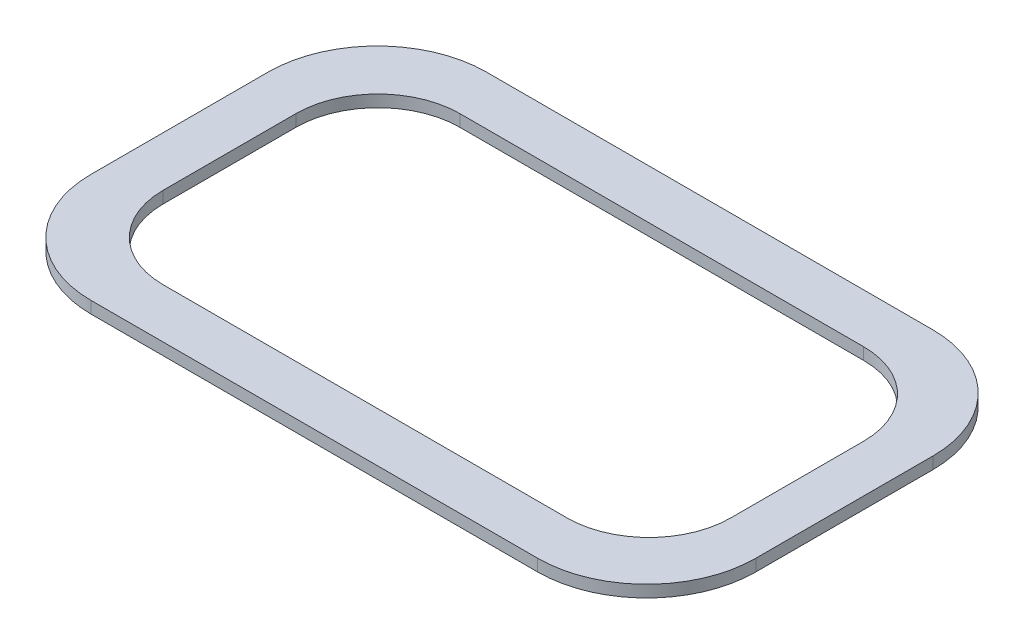
ISO-10303-21;
HEADER;
FILE_DESCRIPTION(('STEP AP214'),'2;1');
FILE_NAME('part.step','',(''),(''),'','','');
FILE_SCHEMA(('AUTOMOTIVE_DESIGN { 1 0 10303 214 1 1 1 1 }'));
ENDSEC;
DATA;
#1=APPLICATION_CONTEXT('core data for automotive mechanical design processes');
#2=APPLICATION_PROTOCOL_DEFINITION('international standard','automotive_design',2000,#1);
#3=PRODUCT_CONTEXT('',#1,'mechanical');
#4=PRODUCT('Part','Part','',(#3));
#5=PRODUCT_RELATED_PRODUCT_CATEGORY('part','',(#4));
#6=PRODUCT_DEFINITION_FORMATION('','',#4);
#7=PRODUCT_DEFINITION_CONTEXT('part definition',#1,'design');
#8=PRODUCT_DEFINITION('design','',#6,#7);
#9=PRODUCT_DEFINITION_SHAPE('','',#8);
#10=(LENGTH_UNIT() NAMED_UNIT(*) SI_UNIT(.MILLI.,.METRE.));
#11=(NAMED_UNIT(*) PLANE_ANGLE_UNIT() SI_UNIT($,.RADIAN.));
#12=(NAMED_UNIT(*) SI_UNIT($,.STERADIAN.) SOLID_ANGLE_UNIT());
#13=UNCERTAINTY_MEASURE_WITH_UNIT(LENGTH_MEASURE(1.E-05),#10,'distance_accuracy_value','');
#14=(GEOMETRIC_REPRESENTATION_CONTEXT(3) GLOBAL_UNCERTAINTY_ASSIGNED_CONTEXT((#13)) GLOBAL_UNIT_ASSIGNED_CONTEXT((#10,
#11,#12)) REPRESENTATION_CONTEXT('',''));
#15=CARTESIAN_POINT('',(0.,0.,0.));
#16=DIRECTION('',(0.,0.,1.));
#17=DIRECTION('',(1.,0.,0.));
#18=AXIS2_PLACEMENT_3D('',#15,#16,#17);
#19=CARTESIAN_POINT('',(-21.0437864395169,6.,113.126130914256));
#20=DIRECTION('',(0.,1.,0.));
#21=DIRECTION('',(0.,0.,1.));
#22=AXIS2_PLACEMENT_3D('',#19,#20,#21);
#23=PLANE('',#22);
#24=CARTESIAN_POINT('',(-21.0437864395169,6.,113.126130914256));
#25=DIRECTION('',(0.,1.,0.));
#26=DIRECTION('',(0.,0.,1.));
#27=AXIS2_PLACEMENT_3D('',#24,#25,#26);
#28=CIRCLE('',#27,55.);
#29=CARTESIAN_POINT('',(-76.0437864395169,6.,113.126130914255));
#30=VERTEX_POINT('',#29);
#31=CARTESIAN_POINT('',(-21.0437864395165,6.,168.126130914256));
#32=VERTEX_POINT('',#31);
#33=EDGE_CURVE('E211',#30,#32,#28,.T.);
#34=ORIENTED_EDGE('',*,*,#33,.T.);
#35=DIRECTION('',(1.,0.,0.));
#36=VECTOR('',#35,1.);
#37=CARTESIAN_POINT('',(-21.0437864395165,6.,168.126130914256));
#38=LINE('',#37,#36);
#39=CARTESIAN_POINT('',(203.986213560483,6.,168.126130914256));
#40=VERTEX_POINT('',#39);
#41=EDGE_CURVE('E214',#32,#40,#38,.T.);
#42=ORIENTED_EDGE('',*,*,#41,.T.);
#43=CARTESIAN_POINT('',(203.986213560483,6.,113.126130914256));
#44=DIRECTION('',(0.,1.,0.));
#45=DIRECTION('',(0.,0.,1.));
#46=AXIS2_PLACEMENT_3D('',#43,#44,#45);
#47=CIRCLE('',#46,55.);
#48=CARTESIAN_POINT('',(258.986213560483,6.,113.126130914255));
#49=VERTEX_POINT('',#48);
#50=EDGE_CURVE('E217',#40,#49,#47,.T.);
#51=ORIENTED_EDGE('',*,*,#50,.T.);
#52=DIRECTION('',(0.,0.,-1.));
#53=VECTOR('',#52,1.);
#54=CARTESIAN_POINT('',(258.986213560483,6.,23.8661309142561));
#55=LINE('',#54,#53);
#56=CARTESIAN_POINT('',(258.986213560483,6.,23.8661309142561));
#57=VERTEX_POINT('',#56);
#58=EDGE_CURVE('E219',#49,#57,#55,.T.);
#59=ORIENTED_EDGE('',*,*,#58,.T.);
#60=CARTESIAN_POINT('',(203.986213560483,6.,23.8661309142557));
#61=DIRECTION('',(0.,1.,0.));
#62=DIRECTION('',(0.,0.,-1.));
#63=AXIS2_PLACEMENT_3D('',#60,#61,#62);
#64=CIRCLE('',#63,55.);
#65=CARTESIAN_POINT('',(203.986213560483,6.,-31.1338690857443));
#66=VERTEX_POINT('',#65);
#67=EDGE_CURVE('E221',#57,#66,#64,.T.);
#68=ORIENTED_EDGE('',*,*,#67,.T.);
#69=DIRECTION('',(-1.,0.,0.));
#70=VECTOR('',#69,1.);
#71=CARTESIAN_POINT('',(-21.0437864395165,6.,-31.1338690857443));
#72=LINE('',#71,#70);
#73=CARTESIAN_POINT('',(-21.0437864395165,6.,-31.1338690857443));
#74=VERTEX_POINT('',#73);
#75=EDGE_CURVE('E223',#66,#74,#72,.T.);
#76=ORIENTED_EDGE('',*,*,#75,.T.);
#77=CARTESIAN_POINT('',(-21.0437864395169,6.,23.8661309142557));
#78=DIRECTION('',(0.,1.,0.));
#79=DIRECTION('',(0.,0.,1.));
#80=AXIS2_PLACEMENT_3D('',#77,#78,#79);
#81=CIRCLE('',#80,55.);
#82=CARTESIAN_POINT('',(-76.0437864395169,6.,23.8661309142561));
#83=VERTEX_POINT('',#82);
#84=EDGE_CURVE('E225',#74,#83,#81,.T.);
#85=ORIENTED_EDGE('',*,*,#84,.T.);
#86=DIRECTION('',(0.,0.,1.));
#87=VECTOR('',#86,1.);
#88=CARTESIAN_POINT('',(-76.0437864395169,6.,23.8661309142561));
#89=LINE('',#88,#87);
#90=EDGE_CURVE('E227',#83,#30,#89,.T.);
#91=ORIENTED_EDGE('',*,*,#90,.T.);
#92=EDGE_LOOP('',(#34,#42,#51,#59,#68,#76,#85,#91));
#93=FACE_BOUND('',#92,.T.);
#94=DIRECTION('',(1.,0.,0.));
#95=VECTOR('',#94,1.);
#96=CARTESIAN_POINT('',(-9.66672983236241,6.,143.126130914256));
#97=LINE('',#96,#95);
#98=CARTESIAN_POINT('',(-9.66672983236241,6.,143.126130914256));
#99=VERTEX_POINT('',#98);
#100=CARTESIAN_POINT('',(193.844893330854,6.,143.126130914256));
#101=VERTEX_POINT('',#100);
#102=EDGE_CURVE('E154',#99,#101,#97,.T.);
#103=ORIENTED_EDGE('',*,*,#102,.F.);
#104=CARTESIAN_POINT('',(-9.66672983236272,6.,101.876130914256));
#105=DIRECTION('',(0.,1.,0.));
#106=DIRECTION('',(0.,0.,1.));
#107=AXIS2_PLACEMENT_3D('',#104,#105,#106);
#108=CIRCLE('',#107,41.25);
#109=CARTESIAN_POINT('',(-50.9167298323627,6.,101.876130914255));
#110=VERTEX_POINT('',#109);
#111=EDGE_CURVE('E146',#110,#99,#108,.T.);
#112=ORIENTED_EDGE('',*,*,#111,.F.);
#113=DIRECTION('',(0.,0.,1.));
#114=VECTOR('',#113,1.);
#115=CARTESIAN_POINT('',(-50.9167298323627,6.,34.931130914256));
#116=LINE('',#115,#114);
#117=CARTESIAN_POINT('',(-50.9167298323627,6.,34.931130914256));
#118=VERTEX_POINT('',#117);
#119=EDGE_CURVE('E179',#118,#110,#116,.T.);
#120=ORIENTED_EDGE('',*,*,#119,.F.);
#121=CARTESIAN_POINT('',(-9.66672983236275,6.,34.9311309142557));
#122=DIRECTION('',(0.,1.,0.));
#123=DIRECTION('',(0.,0.,1.));
#124=AXIS2_PLACEMENT_3D('',#121,#122,#123);
#125=CIRCLE('',#124,41.25);
#126=CARTESIAN_POINT('',(-9.66672983236247,6.,-6.31886908574426));
#127=VERTEX_POINT('',#126);
#128=EDGE_CURVE('E177',#127,#118,#125,.T.);
#129=ORIENTED_EDGE('',*,*,#128,.F.);
#130=DIRECTION('',(-1.,0.,0.));
#131=VECTOR('',#130,1.);
#132=CARTESIAN_POINT('',(-9.66672983236247,6.,-6.31886908574426));
#133=LINE('',#132,#131);
#134=CARTESIAN_POINT('',(193.844893330854,6.,-6.31886908574426));
#135=VERTEX_POINT('',#134);
#136=EDGE_CURVE('E175',#135,#127,#133,.T.);
#137=ORIENTED_EDGE('',*,*,#136,.F.);
#138=CARTESIAN_POINT('',(193.844893330854,6.,34.9311309142557));
#139=DIRECTION('',(0.,1.,0.));
#140=DIRECTION('',(0.,0.,-1.));
#141=AXIS2_PLACEMENT_3D('',#138,#139,#140);
#142=CIRCLE('',#141,41.25);
#143=CARTESIAN_POINT('',(235.094893330854,6.,34.931130914256));
#144=VERTEX_POINT('',#143);
#145=EDGE_CURVE('E173',#144,#135,#142,.T.);
#146=ORIENTED_EDGE('',*,*,#145,.F.);
#147=DIRECTION('',(0.,0.,-1.));
#148=VECTOR('',#147,1.);
#149=CARTESIAN_POINT('',(235.094893330854,6.,34.931130914256));
#150=LINE('',#149,#148);
#151=CARTESIAN_POINT('',(235.094893330854,6.,101.876130914255));
#152=VERTEX_POINT('',#151);
#153=EDGE_CURVE('E169',#152,#144,#150,.T.);
#154=ORIENTED_EDGE('',*,*,#153,.F.);
#155=CARTESIAN_POINT('',(193.844893330854,6.,101.876130914256));
#156=DIRECTION('',(0.,1.,0.));
#157=DIRECTION('',(0.,0.,1.));
#158=AXIS2_PLACEMENT_3D('',#155,#156,#157);
#159=CIRCLE('',#158,41.25);
#160=EDGE_CURVE('E167',#101,#152,#159,.T.);
#161=ORIENTED_EDGE('',*,*,#160,.F.);
#162=EDGE_LOOP('',(#103,#112,#120,#129,#137,#146,#154,#161));
#163=FACE_BOUND('',#162,.T.);
#164=ADVANCED_FACE('F33',(#93,#163),#23,.T.);
#165=CARTESIAN_POINT('',(-21.0437864395169,0.,113.126130914256));
#166=DIRECTION('',(0.,1.,0.));
#167=DIRECTION('',(0.,0.,1.));
#168=AXIS2_PLACEMENT_3D('',#165,#166,#167);
#169=PLANE('',#168);
#170=CARTESIAN_POINT('',(-21.0437864395169,0.,113.126130914256));
#171=DIRECTION('',(0.,1.,0.));
#172=DIRECTION('',(0.,0.,1.));
#173=AXIS2_PLACEMENT_3D('',#170,#171,#172);
#174=CIRCLE('',#173,55.);
#175=CARTESIAN_POINT('',(-76.0437864395169,0.,113.126130914255));
#176=VERTEX_POINT('',#175);
#177=CARTESIAN_POINT('',(-21.0437864395165,0.,168.126130914256));
#178=VERTEX_POINT('',#177);
#179=EDGE_CURVE('E162',#176,#178,#174,.T.);
#180=ORIENTED_EDGE('',*,*,#179,.F.);
#181=DIRECTION('',(0.,0.,1.));
#182=VECTOR('',#181,1.);
#183=CARTESIAN_POINT('',(-76.0437864395169,0.,23.8661309142561));
#184=LINE('',#183,#182);
#185=CARTESIAN_POINT('',(-76.0437864395169,0.,23.8661309142561));
#186=VERTEX_POINT('',#185);
#187=EDGE_CURVE('E215',#186,#176,#184,.T.);
#188=ORIENTED_EDGE('',*,*,#187,.F.);
#189=CARTESIAN_POINT('',(-21.0437864395169,0.,23.8661309142557));
#190=DIRECTION('',(0.,1.,0.));
#191=DIRECTION('',(0.,0.,1.));
#192=AXIS2_PLACEMENT_3D('',#189,#190,#191);
#193=CIRCLE('',#192,55.);
#194=CARTESIAN_POINT('',(-21.0437864395165,0.,-31.1338690857443));
#195=VERTEX_POINT('',#194);
#196=EDGE_CURVE('E242',#195,#186,#193,.T.);
#197=ORIENTED_EDGE('',*,*,#196,.F.);
#198=DIRECTION('',(-1.,0.,0.));
#199=VECTOR('',#198,1.);
#200=CARTESIAN_POINT('',(-21.0437864395165,0.,-31.1338690857443));
#201=LINE('',#200,#199);
#202=CARTESIAN_POINT('',(203.986213560483,0.,-31.1338690857443));
#203=VERTEX_POINT('',#202);
#204=EDGE_CURVE('E240',#203,#195,#201,.T.);
#205=ORIENTED_EDGE('',*,*,#204,.F.);
#206=CARTESIAN_POINT('',(203.986213560483,0.,23.8661309142557));
#207=DIRECTION('',(0.,1.,0.));
#208=DIRECTION('',(0.,0.,-1.));
#209=AXIS2_PLACEMENT_3D('',#206,#207,#208);
#210=CIRCLE('',#209,55.);
#211=CARTESIAN_POINT('',(258.986213560483,0.,23.8661309142561));
#212=VERTEX_POINT('',#211);
#213=EDGE_CURVE('E238',#212,#203,#210,.T.);
#214=ORIENTED_EDGE('',*,*,#213,.F.);
#215=DIRECTION('',(0.,0.,-1.));
#216=VECTOR('',#215,1.);
#217=CARTESIAN_POINT('',(258.986213560483,0.,23.8661309142561));
#218=LINE('',#217,#216);
#219=CARTESIAN_POINT('',(258.986213560483,0.,113.126130914255));
#220=VERTEX_POINT('',#219);
#221=EDGE_CURVE('E236',#220,#212,#218,.T.);
#222=ORIENTED_EDGE('',*,*,#221,.F.);
#223=CARTESIAN_POINT('',(203.986213560483,0.,113.126130914256));
#224=DIRECTION('',(0.,1.,0.));
#225=DIRECTION('',(0.,0.,1.));
#226=AXIS2_PLACEMENT_3D('',#223,#224,#225);
#227=CIRCLE('',#226,55.);
#228=CARTESIAN_POINT('',(203.986213560483,0.,168.126130914256));
#229=VERTEX_POINT('',#228);
#230=EDGE_CURVE('E234',#229,#220,#227,.T.);
#231=ORIENTED_EDGE('',*,*,#230,.F.);
#232=DIRECTION('',(1.,0.,0.));
#233=VECTOR('',#232,1.);
#234=CARTESIAN_POINT('',(-21.0437864395165,0.,168.126130914256));
#235=LINE('',#234,#233);
#236=EDGE_CURVE('E232',#178,#229,#235,.T.);
#237=ORIENTED_EDGE('',*,*,#236,.F.);
#238=EDGE_LOOP('',(#180,#188,#197,#205,#214,#222,#231,#237));
#239=FACE_BOUND('',#238,.T.);
#240=CARTESIAN_POINT('',(-9.66672983236272,0.,101.876130914256));
#241=DIRECTION('',(0.,1.,0.));
#242=DIRECTION('',(0.,0.,1.));
#243=AXIS2_PLACEMENT_3D('',#240,#241,#242);
#244=CIRCLE('',#243,41.25);
#245=CARTESIAN_POINT('',(-50.9167298323627,0.,101.876130914255));
#246=VERTEX_POINT('',#245);
#247=CARTESIAN_POINT('',(-9.66672983236241,0.,143.126130914256));
#248=VERTEX_POINT('',#247);
#249=EDGE_CURVE('E56',#246,#248,#244,.T.);
#250=ORIENTED_EDGE('',*,*,#249,.T.);
#251=DIRECTION('',(1.,0.,0.));
#252=VECTOR('',#251,1.);
#253=CARTESIAN_POINT('',(-9.66672983236241,0.,143.126130914256));
#254=LINE('',#253,#252);
#255=CARTESIAN_POINT('',(193.844893330854,0.,143.126130914256));
#256=VERTEX_POINT('',#255);
#257=EDGE_CURVE('E161',#248,#256,#254,.T.);
#258=ORIENTED_EDGE('',*,*,#257,.T.);
#259=CARTESIAN_POINT('',(193.844893330854,0.,101.876130914256));
#260=DIRECTION('',(0.,1.,0.));
#261=DIRECTION('',(0.,0.,1.));
#262=AXIS2_PLACEMENT_3D('',#259,#260,#261);
#263=CIRCLE('',#262,41.25);
#264=CARTESIAN_POINT('',(235.094893330854,0.,101.876130914255));
#265=VERTEX_POINT('',#264);
#266=EDGE_CURVE('E183',#256,#265,#263,.T.);
#267=ORIENTED_EDGE('',*,*,#266,.T.);
#268=DIRECTION('',(0.,0.,-1.));
#269=VECTOR('',#268,1.);
#270=CARTESIAN_POINT('',(235.094893330854,0.,34.931130914256));
#271=LINE('',#270,#269);
#272=CARTESIAN_POINT('',(235.094893330854,0.,34.931130914256));
#273=VERTEX_POINT('',#272);
#274=EDGE_CURVE('E186',#265,#273,#271,.T.);
#275=ORIENTED_EDGE('',*,*,#274,.T.);
#276=CARTESIAN_POINT('',(193.844893330854,0.,34.9311309142557));
#277=DIRECTION('',(0.,1.,0.));
#278=DIRECTION('',(0.,0.,-1.));
#279=AXIS2_PLACEMENT_3D('',#276,#277,#278);
#280=CIRCLE('',#279,41.25);
#281=CARTESIAN_POINT('',(193.844893330854,0.,-6.31886908574426));
#282=VERTEX_POINT('',#281);
#283=EDGE_CURVE('E189',#273,#282,#280,.T.);
#284=ORIENTED_EDGE('',*,*,#283,.T.);
#285=DIRECTION('',(-1.,0.,0.));
#286=VECTOR('',#285,1.);
#287=CARTESIAN_POINT('',(-9.66672983236247,0.,-6.31886908574426));
#288=LINE('',#287,#286);
#289=CARTESIAN_POINT('',(-9.66672983236247,0.,-6.31886908574426));
#290=VERTEX_POINT('',#289);
#291=EDGE_CURVE('E192',#282,#290,#288,.T.);
#292=ORIENTED_EDGE('',*,*,#291,.T.);
#293=CARTESIAN_POINT('',(-9.66672983236275,0.,34.9311309142557));
#294=DIRECTION('',(0.,1.,0.));
#295=DIRECTION('',(0.,0.,1.));
#296=AXIS2_PLACEMENT_3D('',#293,#294,#295);
#297=CIRCLE('',#296,41.25);
#298=CARTESIAN_POINT('',(-50.9167298323627,0.,34.931130914256));
#299=VERTEX_POINT('',#298);
#300=EDGE_CURVE('E195',#290,#299,#297,.T.);
#301=ORIENTED_EDGE('',*,*,#300,.T.);
#302=DIRECTION('',(0.,0.,1.));
#303=VECTOR('',#302,1.);
#304=CARTESIAN_POINT('',(-50.9167298323627,0.,34.931130914256));
#305=LINE('',#304,#303);
#306=EDGE_CURVE('E155',#299,#246,#305,.T.);
#307=ORIENTED_EDGE('',*,*,#306,.T.);
#308=EDGE_LOOP('',(#250,#258,#267,#275,#284,#292,#301,#307));
#309=FACE_BOUND('',#308,.T.);
#310=ADVANCED_FACE('F272',(#239,#309),#169,.F.);
#311=CARTESIAN_POINT('',(-21.0437864395169,6.,113.126130914256));
#312=DIRECTION('',(0.,-1.,0.));
#313=DIRECTION('',(0.,0.,-1.));
#314=AXIS2_PLACEMENT_3D('',#311,#312,#313);
#315=CYLINDRICAL_SURFACE('',#314,55.);
#316=ORIENTED_EDGE('',*,*,#179,.T.);
#317=DIRECTION('',(0.,-1.,0.));
#318=VECTOR('',#317,1.);
#319=CARTESIAN_POINT('',(-21.0437864395165,6.,168.126130914256));
#320=LINE('',#319,#318);
#321=EDGE_CURVE('E11',#32,#178,#320,.T.);
#322=ORIENTED_EDGE('',*,*,#321,.F.);
#323=ORIENTED_EDGE('',*,*,#33,.F.);
#324=DIRECTION('',(0.,-1.,0.));
#325=VECTOR('',#324,1.);
#326=CARTESIAN_POINT('',(-76.0437864395169,6.,113.126130914255));
#327=LINE('',#326,#325);
#328=EDGE_CURVE('E229',#30,#176,#327,.T.);
#329=ORIENTED_EDGE('',*,*,#328,.T.);
#330=EDGE_LOOP('',(#316,#322,#323,#329));
#331=FACE_BOUND('',#330,.T.);
#332=ADVANCED_FACE('F35',(#331),#315,.T.);
#333=CARTESIAN_POINT('',(-21.0437864395165,6.,168.126130914256));
#334=DIRECTION('',(0.,0.,-1.));
#335=DIRECTION('',(-1.,0.,0.));
#336=AXIS2_PLACEMENT_3D('',#333,#334,#335);
#337=PLANE('',#336);
#338=ORIENTED_EDGE('',*,*,#236,.T.);
#339=DIRECTION('',(0.,-1.,0.));
#340=VECTOR('',#339,1.);
#341=CARTESIAN_POINT('',(203.986213560483,6.,168.126130914256));
#342=LINE('',#341,#340);
#343=EDGE_CURVE('E41',#40,#229,#342,.T.);
#344=ORIENTED_EDGE('',*,*,#343,.F.);
#345=ORIENTED_EDGE('',*,*,#41,.F.);
#346=ORIENTED_EDGE('',*,*,#321,.T.);
#347=EDGE_LOOP('',(#338,#344,#345,#346));
#348=FACE_BOUND('',#347,.T.);
#349=ADVANCED_FACE('F289',(#348),#337,.F.);
#350=CARTESIAN_POINT('',(203.986213560483,6.,113.126130914256));
#351=DIRECTION('',(0.,-1.,0.));
#352=DIRECTION('',(0.,0.,-1.));
#353=AXIS2_PLACEMENT_3D('',#350,#351,#352);
#354=CYLINDRICAL_SURFACE('',#353,55.);
#355=ORIENTED_EDGE('',*,*,#230,.T.);
#356=DIRECTION('',(0.,-1.,0.));
#357=VECTOR('',#356,1.);
#358=CARTESIAN_POINT('',(258.986213560483,6.,113.126130914255));
#359=LINE('',#358,#357);
#360=EDGE_CURVE('E259',#49,#220,#359,.T.);
#361=ORIENTED_EDGE('',*,*,#360,.F.);
#362=ORIENTED_EDGE('',*,*,#50,.F.);
#363=ORIENTED_EDGE('',*,*,#343,.T.);
#364=EDGE_LOOP('',(#355,#361,#362,#363));
#365=FACE_BOUND('',#364,.T.);
#366=ADVANCED_FACE('F266',(#365),#354,.T.);
#367=CARTESIAN_POINT('',(258.986213560483,6.,23.8661309142561));
#368=DIRECTION('',(-1.,0.,0.));
#369=DIRECTION('',(0.,0.,1.));
#370=AXIS2_PLACEMENT_3D('',#367,#368,#369);
#371=PLANE('',#370);
#372=ORIENTED_EDGE('',*,*,#221,.T.);
#373=DIRECTION('',(0.,-1.,0.));
#374=VECTOR('',#373,1.);
#375=CARTESIAN_POINT('',(258.986213560483,6.,23.8661309142561));
#376=LINE('',#375,#374);
#377=EDGE_CURVE('E256',#57,#212,#376,.T.);
#378=ORIENTED_EDGE('',*,*,#377,.F.);
#379=ORIENTED_EDGE('',*,*,#58,.F.);
#380=ORIENTED_EDGE('',*,*,#360,.T.);
#381=EDGE_LOOP('',(#372,#378,#379,#380));
#382=FACE_BOUND('',#381,.T.);
#383=ADVANCED_FACE('F278',(#382),#371,.F.);
#384=CARTESIAN_POINT('',(203.986213560483,6.,23.8661309142557));
#385=DIRECTION('',(0.,-1.,0.));
#386=DIRECTION('',(0.,0.,-1.));
#387=AXIS2_PLACEMENT_3D('',#384,#385,#386);
#388=CYLINDRICAL_SURFACE('',#387,55.);
#389=ORIENTED_EDGE('',*,*,#213,.T.);
#390=DIRECTION('',(0.,-1.,0.));
#391=VECTOR('',#390,1.);
#392=CARTESIAN_POINT('',(203.986213560483,6.,-31.1338690857443));
#393=LINE('',#392,#391);
#394=EDGE_CURVE('E253',#66,#203,#393,.T.);
#395=ORIENTED_EDGE('',*,*,#394,.F.);
#396=ORIENTED_EDGE('',*,*,#67,.F.);
#397=ORIENTED_EDGE('',*,*,#377,.T.);
#398=EDGE_LOOP('',(#389,#395,#396,#397));
#399=FACE_BOUND('',#398,.T.);
#400=ADVANCED_FACE('F282',(#399),#388,.T.);
#401=CARTESIAN_POINT('',(-21.0437864395165,6.,-31.1338690857443));
#402=DIRECTION('',(0.,0.,1.));
#403=DIRECTION('',(1.,0.,0.));
#404=AXIS2_PLACEMENT_3D('',#401,#402,#403);
#405=PLANE('',#404);
#406=ORIENTED_EDGE('',*,*,#204,.T.);
#407=DIRECTION('',(0.,-1.,0.));
#408=VECTOR('',#407,1.);
#409=CARTESIAN_POINT('',(-21.0437864395165,6.,-31.1338690857443));
#410=LINE('',#409,#408);
#411=EDGE_CURVE('E250',#74,#195,#410,.T.);
#412=ORIENTED_EDGE('',*,*,#411,.F.);
#413=ORIENTED_EDGE('',*,*,#75,.F.);
#414=ORIENTED_EDGE('',*,*,#394,.T.);
#415=EDGE_LOOP('',(#406,#412,#413,#414));
#416=FACE_BOUND('',#415,.T.);
#417=ADVANCED_FACE('F302',(#416),#405,.F.);
#418=CARTESIAN_POINT('',(-21.0437864395169,6.,23.8661309142557));
#419=DIRECTION('',(0.,-1.,0.));
#420=DIRECTION('',(0.,0.,-1.));
#421=AXIS2_PLACEMENT_3D('',#418,#419,#420);
#422=CYLINDRICAL_SURFACE('',#421,55.);
#423=ORIENTED_EDGE('',*,*,#196,.T.);
#424=DIRECTION('',(0.,-1.,0.));
#425=VECTOR('',#424,1.);
#426=CARTESIAN_POINT('',(-76.0437864395169,6.,23.8661309142561));
#427=LINE('',#426,#425);
#428=EDGE_CURVE('E247',#83,#186,#427,.T.);
#429=ORIENTED_EDGE('',*,*,#428,.F.);
#430=ORIENTED_EDGE('',*,*,#84,.F.);
#431=ORIENTED_EDGE('',*,*,#411,.T.);
#432=EDGE_LOOP('',(#423,#429,#430,#431));
#433=FACE_BOUND('',#432,.T.);
#434=ADVANCED_FACE('F300',(#433),#422,.T.);
#435=CARTESIAN_POINT('',(-76.0437864395169,6.,23.8661309142561));
#436=DIRECTION('',(1.,0.,0.));
#437=DIRECTION('',(0.,0.,-1.));
#438=AXIS2_PLACEMENT_3D('',#435,#436,#437);
#439=PLANE('',#438);
#440=ORIENTED_EDGE('',*,*,#187,.T.);
#441=ORIENTED_EDGE('',*,*,#328,.F.);
#442=ORIENTED_EDGE('',*,*,#90,.F.);
#443=ORIENTED_EDGE('',*,*,#428,.T.);
#444=EDGE_LOOP('',(#440,#441,#442,#443));
#445=FACE_BOUND('',#444,.T.);
#446=ADVANCED_FACE('F295',(#445),#439,.F.);
#447=CARTESIAN_POINT('',(-9.66672983236272,6.,101.876130914256));
#448=DIRECTION('',(0.,-1.,0.));
#449=DIRECTION('',(0.,0.,-1.));
#450=AXIS2_PLACEMENT_3D('',#447,#448,#449);
#451=CYLINDRICAL_SURFACE('',#450,41.25);
#452=ORIENTED_EDGE('',*,*,#249,.F.);
#453=DIRECTION('',(0.,-1.,0.));
#454=VECTOR('',#453,1.);
#455=CARTESIAN_POINT('',(-50.9167298323627,6.,101.876130914255));
#456=LINE('',#455,#454);
#457=EDGE_CURVE('E150',#110,#246,#456,.T.);
#458=ORIENTED_EDGE('',*,*,#457,.F.);
#459=ORIENTED_EDGE('',*,*,#111,.T.);
#460=DIRECTION('',(0.,-1.,0.));
#461=VECTOR('',#460,1.);
#462=CARTESIAN_POINT('',(-9.66672983236241,6.,143.126130914256));
#463=LINE('',#462,#461);
#464=EDGE_CURVE('E149',#99,#248,#463,.T.);
#465=ORIENTED_EDGE('',*,*,#464,.T.);
#466=EDGE_LOOP('',(#452,#458,#459,#465));
#467=FACE_BOUND('',#466,.T.);
#468=ADVANCED_FACE('F148',(#467),#451,.F.);
#469=CARTESIAN_POINT('',(-9.66672983236241,6.,143.126130914256));
#470=DIRECTION('',(0.,0.,-1.));
#471=DIRECTION('',(-1.,0.,0.));
#472=AXIS2_PLACEMENT_3D('',#469,#470,#471);
#473=PLANE('',#472);
#474=ORIENTED_EDGE('',*,*,#257,.F.);
#475=ORIENTED_EDGE('',*,*,#464,.F.);
#476=ORIENTED_EDGE('',*,*,#102,.T.);
#477=DIRECTION('',(0.,-1.,0.));
#478=VECTOR('',#477,1.);
#479=CARTESIAN_POINT('',(193.844893330854,6.,143.126130914256));
#480=LINE('',#479,#478);
#481=EDGE_CURVE('E163',#101,#256,#480,.T.);
#482=ORIENTED_EDGE('',*,*,#481,.T.);
#483=EDGE_LOOP('',(#474,#475,#476,#482));
#484=FACE_BOUND('',#483,.T.);
#485=ADVANCED_FACE('F158',(#484),#473,.T.);
#486=CARTESIAN_POINT('',(193.844893330854,6.,101.876130914256));
#487=DIRECTION('',(0.,-1.,0.));
#488=DIRECTION('',(0.,0.,-1.));
#489=AXIS2_PLACEMENT_3D('',#486,#487,#488);
#490=CYLINDRICAL_SURFACE('',#489,41.25);
#491=ORIENTED_EDGE('',*,*,#266,.F.);
#492=ORIENTED_EDGE('',*,*,#481,.F.);
#493=ORIENTED_EDGE('',*,*,#160,.T.);
#494=DIRECTION('',(0.,-1.,0.));
#495=VECTOR('',#494,1.);
#496=CARTESIAN_POINT('',(235.094893330854,6.,101.876130914255));
#497=LINE('',#496,#495);
#498=EDGE_CURVE('E208',#152,#265,#497,.T.);
#499=ORIENTED_EDGE('',*,*,#498,.T.);
#500=EDGE_LOOP('',(#491,#492,#493,#499));
#501=FACE_BOUND('',#500,.T.);
#502=ADVANCED_FACE('F327',(#501),#490,.F.);
#503=CARTESIAN_POINT('',(235.094893330854,6.,34.931130914256));
#504=DIRECTION('',(-1.,0.,0.));
#505=DIRECTION('',(0.,0.,1.));
#506=AXIS2_PLACEMENT_3D('',#503,#504,#505);
#507=PLANE('',#506);
#508=ORIENTED_EDGE('',*,*,#274,.F.);
#509=ORIENTED_EDGE('',*,*,#498,.F.);
#510=ORIENTED_EDGE('',*,*,#153,.T.);
#511=DIRECTION('',(0.,-1.,0.));
#512=VECTOR('',#511,1.);
#513=CARTESIAN_POINT('',(235.094893330854,6.,34.931130914256));
#514=LINE('',#513,#512);
#515=EDGE_CURVE('E206',#144,#273,#514,.T.);
#516=ORIENTED_EDGE('',*,*,#515,.T.);
#517=EDGE_LOOP('',(#508,#509,#510,#516));
#518=FACE_BOUND('',#517,.T.);
#519=ADVANCED_FACE('F331',(#518),#507,.T.);
#520=CARTESIAN_POINT('',(193.844893330854,6.,34.9311309142557));
#521=DIRECTION('',(0.,-1.,0.));
#522=DIRECTION('',(0.,0.,-1.));
#523=AXIS2_PLACEMENT_3D('',#520,#521,#522);
#524=CYLINDRICAL_SURFACE('',#523,41.25);
#525=ORIENTED_EDGE('',*,*,#283,.F.);
#526=ORIENTED_EDGE('',*,*,#515,.F.);
#527=ORIENTED_EDGE('',*,*,#145,.T.);
#528=DIRECTION('',(0.,-1.,0.));
#529=VECTOR('',#528,1.);
#530=CARTESIAN_POINT('',(193.844893330854,6.,-6.31886908574426));
#531=LINE('',#530,#529);
#532=EDGE_CURVE('E204',#135,#282,#531,.T.);
#533=ORIENTED_EDGE('',*,*,#532,.T.);
#534=EDGE_LOOP('',(#525,#526,#527,#533));
#535=FACE_BOUND('',#534,.T.);
#536=ADVANCED_FACE('F337',(#535),#524,.F.);
#537=CARTESIAN_POINT('',(-9.66672983236247,6.,-6.31886908574426));
#538=DIRECTION('',(0.,0.,1.));
#539=DIRECTION('',(1.,0.,0.));
#540=AXIS2_PLACEMENT_3D('',#537,#538,#539);
#541=PLANE('',#540);
#542=ORIENTED_EDGE('',*,*,#291,.F.);
#543=ORIENTED_EDGE('',*,*,#532,.F.);
#544=ORIENTED_EDGE('',*,*,#136,.T.);
#545=DIRECTION('',(0.,-1.,0.));
#546=VECTOR('',#545,1.);
#547=CARTESIAN_POINT('',(-9.66672983236247,6.,-6.31886908574426));
#548=LINE('',#547,#546);
#549=EDGE_CURVE('E202',#127,#290,#548,.T.);
#550=ORIENTED_EDGE('',*,*,#549,.T.);
#551=EDGE_LOOP('',(#542,#543,#544,#550));
#552=FACE_BOUND('',#551,.T.);
#553=ADVANCED_FACE('F341',(#552),#541,.T.);
#554=CARTESIAN_POINT('',(-9.66672983236275,6.,34.9311309142557));
#555=DIRECTION('',(0.,-1.,0.));
#556=DIRECTION('',(0.,0.,-1.));
#557=AXIS2_PLACEMENT_3D('',#554,#555,#556);
#558=CYLINDRICAL_SURFACE('',#557,41.25);
#559=ORIENTED_EDGE('',*,*,#300,.F.);
#560=ORIENTED_EDGE('',*,*,#549,.F.);
#561=ORIENTED_EDGE('',*,*,#128,.T.);
#562=DIRECTION('',(0.,-1.,0.));
#563=VECTOR('',#562,1.);
#564=CARTESIAN_POINT('',(-50.9167298323627,6.,34.931130914256));
#565=LINE('',#564,#563);
#566=EDGE_CURVE('E48',#118,#299,#565,.T.);
#567=ORIENTED_EDGE('',*,*,#566,.T.);
#568=EDGE_LOOP('',(#559,#560,#561,#567));
#569=FACE_BOUND('',#568,.T.);
#570=ADVANCED_FACE('F345',(#569),#558,.F.);
#571=CARTESIAN_POINT('',(-50.9167298323627,6.,34.931130914256));
#572=DIRECTION('',(1.,0.,0.));
#573=DIRECTION('',(0.,0.,-1.));
#574=AXIS2_PLACEMENT_3D('',#571,#572,#573);
#575=PLANE('',#574);
#576=ORIENTED_EDGE('',*,*,#306,.F.);
#577=ORIENTED_EDGE('',*,*,#566,.F.);
#578=ORIENTED_EDGE('',*,*,#119,.T.);
#579=ORIENTED_EDGE('',*,*,#457,.T.);
#580=EDGE_LOOP('',(#576,#577,#578,#579));
#581=FACE_BOUND('',#580,.T.);
#582=ADVANCED_FACE('F349',(#581),#575,.T.);
#583=CLOSED_SHELL('',(#164,#310,#332,#349,#366,#383,#400,#417,#434,#446,#468,#485,#502,#519,
#536,#553,#570,#582));
#584=MANIFOLD_SOLID_BREP('B2',#583);
#585=ADVANCED_BREP_SHAPE_REPRESENTATION('',(#18,#584),#14);
#586=SHAPE_DEFINITION_REPRESENTATION(#9,#585);
ENDSEC;
END-ISO-10303-21;
